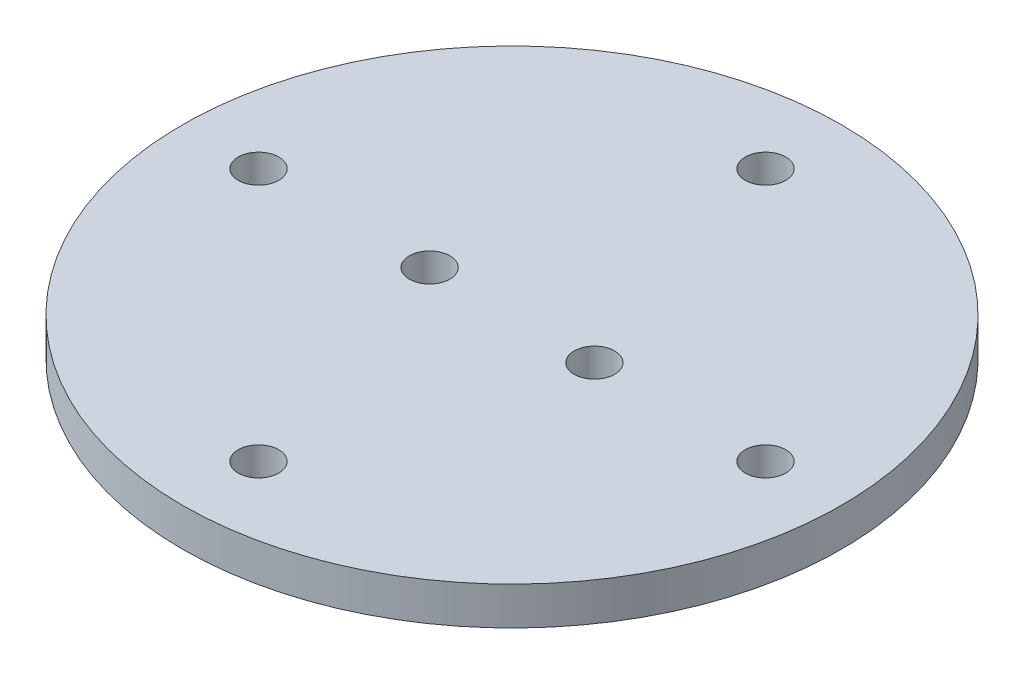
ISO-10303-21;
HEADER;
FILE_DESCRIPTION(('STEP AP214'),'2;1');
FILE_NAME('part.step','',(''),(''),'','','');
FILE_SCHEMA(('AUTOMOTIVE_DESIGN { 1 0 10303 214 1 1 1 1 }'));
ENDSEC;
DATA;
#1=APPLICATION_CONTEXT('core data for automotive mechanical design processes');
#2=APPLICATION_PROTOCOL_DEFINITION('international standard','automotive_design',2000,#1);
#3=PRODUCT_CONTEXT('',#1,'mechanical');
#4=PRODUCT('Part','Part','',(#3));
#5=PRODUCT_RELATED_PRODUCT_CATEGORY('part','',(#4));
#6=PRODUCT_DEFINITION_FORMATION('','',#4);
#7=PRODUCT_DEFINITION_CONTEXT('part definition',#1,'design');
#8=PRODUCT_DEFINITION('design','',#6,#7);
#9=PRODUCT_DEFINITION_SHAPE('','',#8);
#10=(LENGTH_UNIT() NAMED_UNIT(*) SI_UNIT(.MILLI.,.METRE.));
#11=(NAMED_UNIT(*) PLANE_ANGLE_UNIT() SI_UNIT($,.RADIAN.));
#12=(NAMED_UNIT(*) SI_UNIT($,.STERADIAN.) SOLID_ANGLE_UNIT());
#13=UNCERTAINTY_MEASURE_WITH_UNIT(LENGTH_MEASURE(1.E-05),#10,'distance_accuracy_value','');
#14=(GEOMETRIC_REPRESENTATION_CONTEXT(3) GLOBAL_UNCERTAINTY_ASSIGNED_CONTEXT((#13)) GLOBAL_UNIT_ASSIGNED_CONTEXT((#10,
#11,#12)) REPRESENTATION_CONTEXT('',''));
#15=CARTESIAN_POINT('',(0.,0.,0.));
#16=DIRECTION('',(0.,0.,1.));
#17=DIRECTION('',(1.,0.,0.));
#18=AXIS2_PLACEMENT_3D('',#15,#16,#17);
#19=CARTESIAN_POINT('',(0.,3.,0.));
#20=DIRECTION('',(0.,1.,0.));
#21=DIRECTION('',(0.,0.,1.));
#22=AXIS2_PLACEMENT_3D('',#19,#20,#21);
#23=PLANE('',#22);
#24=CARTESIAN_POINT('',(20.,3.,0.));
#25=DIRECTION('',(0.,1.,0.));
#26=DIRECTION('',(0.,0.,1.));
#27=AXIS2_PLACEMENT_3D('',#24,#25,#26);
#28=CIRCLE('',#27,1.6);
#29=CARTESIAN_POINT('',(20.,3.,1.6));
#30=VERTEX_POINT('',#29);
#31=EDGE_CURVE('E73',#30,#30,#28,.T.);
#32=ORIENTED_EDGE('',*,*,#31,.F.);
#33=EDGE_LOOP('',(#32));
#34=FACE_BOUND('',#33,.T.);
#35=CARTESIAN_POINT('',(-20.,3.,0.));
#36=DIRECTION('',(0.,1.,0.));
#37=DIRECTION('',(0.,0.,1.));
#38=AXIS2_PLACEMENT_3D('',#35,#36,#37);
#39=CIRCLE('',#38,1.6);
#40=CARTESIAN_POINT('',(-20.,3.,1.6));
#41=VERTEX_POINT('',#40);
#42=EDGE_CURVE('E61',#41,#41,#39,.T.);
#43=ORIENTED_EDGE('',*,*,#42,.F.);
#44=EDGE_LOOP('',(#43));
#45=FACE_BOUND('',#44,.T.);
#46=CARTESIAN_POINT('',(-6.5,3.,0.));
#47=DIRECTION('',(0.,1.,0.));
#48=DIRECTION('',(0.,0.,1.));
#49=AXIS2_PLACEMENT_3D('',#46,#47,#48);
#50=CIRCLE('',#49,1.6);
#51=CARTESIAN_POINT('',(-6.5,3.,1.6));
#52=VERTEX_POINT('',#51);
#53=EDGE_CURVE('E50',#52,#52,#50,.T.);
#54=ORIENTED_EDGE('',*,*,#53,.F.);
#55=EDGE_LOOP('',(#54));
#56=FACE_BOUND('',#55,.T.);
#57=CARTESIAN_POINT('',(0.,3.,0.));
#58=DIRECTION('',(0.,1.,0.));
#59=DIRECTION('',(0.,0.,1.));
#60=AXIS2_PLACEMENT_3D('',#57,#58,#59);
#61=CIRCLE('',#60,26.);
#62=CARTESIAN_POINT('',(0.,3.,26.));
#63=VERTEX_POINT('',#62);
#64=EDGE_CURVE('E10',#63,#63,#61,.T.);
#65=ORIENTED_EDGE('',*,*,#64,.T.);
#66=EDGE_LOOP('',(#65));
#67=FACE_BOUND('',#66,.T.);
#68=CARTESIAN_POINT('',(6.5,3.,0.));
#69=DIRECTION('',(0.,1.,0.));
#70=DIRECTION('',(0.,0.,1.));
#71=AXIS2_PLACEMENT_3D('',#68,#69,#70);
#72=CIRCLE('',#71,1.6);
#73=CARTESIAN_POINT('',(6.5,3.,1.6));
#74=VERTEX_POINT('',#73);
#75=EDGE_CURVE('E55',#74,#74,#72,.T.);
#76=ORIENTED_EDGE('',*,*,#75,.F.);
#77=EDGE_LOOP('',(#76));
#78=FACE_BOUND('',#77,.T.);
#79=CARTESIAN_POINT('',(0.,3.,-20.));
#80=DIRECTION('',(0.,1.,0.));
#81=DIRECTION('',(0.,0.,1.));
#82=AXIS2_PLACEMENT_3D('',#79,#80,#81);
#83=CIRCLE('',#82,1.6);
#84=CARTESIAN_POINT('',(0.,3.,-18.4));
#85=VERTEX_POINT('',#84);
#86=EDGE_CURVE('E67',#85,#85,#83,.T.);
#87=ORIENTED_EDGE('',*,*,#86,.F.);
#88=EDGE_LOOP('',(#87));
#89=FACE_BOUND('',#88,.T.);
#90=CARTESIAN_POINT('',(0.,3.,20.));
#91=DIRECTION('',(0.,1.,0.));
#92=DIRECTION('',(0.,0.,1.));
#93=AXIS2_PLACEMENT_3D('',#90,#91,#92);
#94=CIRCLE('',#93,1.6);
#95=CARTESIAN_POINT('',(0.,3.,21.6));
#96=VERTEX_POINT('',#95);
#97=EDGE_CURVE('E79',#96,#96,#94,.T.);
#98=ORIENTED_EDGE('',*,*,#97,.F.);
#99=EDGE_LOOP('',(#98));
#100=FACE_BOUND('',#99,.T.);
#101=ADVANCED_FACE('F39',(#34,#45,#56,#67,#78,#89,#100),#23,.T.);
#102=CARTESIAN_POINT('',(0.,0.,0.));
#103=DIRECTION('',(0.,1.,0.));
#104=DIRECTION('',(0.,0.,1.));
#105=AXIS2_PLACEMENT_3D('',#102,#103,#104);
#106=PLANE('',#105);
#107=CARTESIAN_POINT('',(0.,0.,0.));
#108=DIRECTION('',(0.,1.,0.));
#109=DIRECTION('',(0.,0.,1.));
#110=AXIS2_PLACEMENT_3D('',#107,#108,#109);
#111=CIRCLE('',#110,26.);
#112=CARTESIAN_POINT('',(0.,0.,26.));
#113=VERTEX_POINT('',#112);
#114=EDGE_CURVE('E43',#113,#113,#111,.T.);
#115=ORIENTED_EDGE('',*,*,#114,.F.);
#116=EDGE_LOOP('',(#115));
#117=FACE_BOUND('',#116,.T.);
#118=CARTESIAN_POINT('',(-6.5,0.,0.));
#119=DIRECTION('',(0.,1.,0.));
#120=DIRECTION('',(0.,0.,1.));
#121=AXIS2_PLACEMENT_3D('',#118,#119,#120);
#122=CIRCLE('',#121,1.6);
#123=CARTESIAN_POINT('',(-6.5,0.,1.6));
#124=VERTEX_POINT('',#123);
#125=EDGE_CURVE('E52',#124,#124,#122,.T.);
#126=ORIENTED_EDGE('',*,*,#125,.T.);
#127=EDGE_LOOP('',(#126));
#128=FACE_BOUND('',#127,.T.);
#129=CARTESIAN_POINT('',(6.5,0.,0.));
#130=DIRECTION('',(0.,1.,0.));
#131=DIRECTION('',(0.,0.,1.));
#132=AXIS2_PLACEMENT_3D('',#129,#130,#131);
#133=CIRCLE('',#132,1.6);
#134=CARTESIAN_POINT('',(6.5,0.,1.6));
#135=VERTEX_POINT('',#134);
#136=EDGE_CURVE('E58',#135,#135,#133,.T.);
#137=ORIENTED_EDGE('',*,*,#136,.T.);
#138=EDGE_LOOP('',(#137));
#139=FACE_BOUND('',#138,.T.);
#140=CARTESIAN_POINT('',(-20.,0.,0.));
#141=DIRECTION('',(0.,1.,0.));
#142=DIRECTION('',(0.,0.,1.));
#143=AXIS2_PLACEMENT_3D('',#140,#141,#142);
#144=CIRCLE('',#143,1.6);
#145=CARTESIAN_POINT('',(-20.,0.,1.6));
#146=VERTEX_POINT('',#145);
#147=EDGE_CURVE('E64',#146,#146,#144,.T.);
#148=ORIENTED_EDGE('',*,*,#147,.T.);
#149=EDGE_LOOP('',(#148));
#150=FACE_BOUND('',#149,.T.);
#151=CARTESIAN_POINT('',(0.,0.,-20.));
#152=DIRECTION('',(0.,1.,0.));
#153=DIRECTION('',(0.,0.,1.));
#154=AXIS2_PLACEMENT_3D('',#151,#152,#153);
#155=CIRCLE('',#154,1.6);
#156=CARTESIAN_POINT('',(0.,0.,-18.4));
#157=VERTEX_POINT('',#156);
#158=EDGE_CURVE('E70',#157,#157,#155,.T.);
#159=ORIENTED_EDGE('',*,*,#158,.T.);
#160=EDGE_LOOP('',(#159));
#161=FACE_BOUND('',#160,.T.);
#162=CARTESIAN_POINT('',(20.,0.,0.));
#163=DIRECTION('',(0.,1.,0.));
#164=DIRECTION('',(0.,0.,1.));
#165=AXIS2_PLACEMENT_3D('',#162,#163,#164);
#166=CIRCLE('',#165,1.6);
#167=CARTESIAN_POINT('',(20.,0.,1.6));
#168=VERTEX_POINT('',#167);
#169=EDGE_CURVE('E76',#168,#168,#166,.T.);
#170=ORIENTED_EDGE('',*,*,#169,.T.);
#171=EDGE_LOOP('',(#170));
#172=FACE_BOUND('',#171,.T.);
#173=CARTESIAN_POINT('',(0.,0.,20.));
#174=DIRECTION('',(0.,1.,0.));
#175=DIRECTION('',(0.,0.,1.));
#176=AXIS2_PLACEMENT_3D('',#173,#174,#175);
#177=CIRCLE('',#176,1.6);
#178=CARTESIAN_POINT('',(0.,0.,21.6));
#179=VERTEX_POINT('',#178);
#180=EDGE_CURVE('E82',#179,#179,#177,.T.);
#181=ORIENTED_EDGE('',*,*,#180,.T.);
#182=EDGE_LOOP('',(#181));
#183=FACE_BOUND('',#182,.T.);
#184=ADVANCED_FACE('F92',(#117,#128,#139,#150,#161,#172,#183),#106,.F.);
#185=CARTESIAN_POINT('',(0.,3.,0.));
#186=DIRECTION('',(0.,-1.,0.));
#187=DIRECTION('',(0.,0.,-1.));
#188=AXIS2_PLACEMENT_3D('',#185,#186,#187);
#189=CYLINDRICAL_SURFACE('',#188,26.);
#190=ORIENTED_EDGE('',*,*,#64,.F.);
#191=EDGE_LOOP('',(#190));
#192=FACE_BOUND('',#191,.T.);
#193=ORIENTED_EDGE('',*,*,#114,.T.);
#194=EDGE_LOOP('',(#193));
#195=FACE_BOUND('',#194,.T.);
#196=ADVANCED_FACE('F41',(#192,#195),#189,.T.);
#197=CARTESIAN_POINT('',(-6.5,3.,0.));
#198=DIRECTION('',(0.,-1.,0.));
#199=DIRECTION('',(0.,0.,-1.));
#200=AXIS2_PLACEMENT_3D('',#197,#198,#199);
#201=CYLINDRICAL_SURFACE('',#200,1.6);
#202=ORIENTED_EDGE('',*,*,#53,.T.);
#203=EDGE_LOOP('',(#202));
#204=FACE_BOUND('',#203,.T.);
#205=ORIENTED_EDGE('',*,*,#125,.F.);
#206=EDGE_LOOP('',(#205));
#207=FACE_BOUND('',#206,.T.);
#208=ADVANCED_FACE('F102',(#204,#207),#201,.F.);
#209=CARTESIAN_POINT('',(6.5,3.,0.));
#210=DIRECTION('',(0.,-1.,0.));
#211=DIRECTION('',(0.,0.,-1.));
#212=AXIS2_PLACEMENT_3D('',#209,#210,#211);
#213=CYLINDRICAL_SURFACE('',#212,1.6);
#214=ORIENTED_EDGE('',*,*,#75,.T.);
#215=EDGE_LOOP('',(#214));
#216=FACE_BOUND('',#215,.T.);
#217=ORIENTED_EDGE('',*,*,#136,.F.);
#218=EDGE_LOOP('',(#217));
#219=FACE_BOUND('',#218,.T.);
#220=ADVANCED_FACE('F105',(#216,#219),#213,.F.);
#221=CARTESIAN_POINT('',(-20.,3.,0.));
#222=DIRECTION('',(0.,-1.,0.));
#223=DIRECTION('',(0.,0.,-1.));
#224=AXIS2_PLACEMENT_3D('',#221,#222,#223);
#225=CYLINDRICAL_SURFACE('',#224,1.6);
#226=ORIENTED_EDGE('',*,*,#42,.T.);
#227=EDGE_LOOP('',(#226));
#228=FACE_BOUND('',#227,.T.);
#229=ORIENTED_EDGE('',*,*,#147,.F.);
#230=EDGE_LOOP('',(#229));
#231=FACE_BOUND('',#230,.T.);
#232=ADVANCED_FACE('F109',(#228,#231),#225,.F.);
#233=CARTESIAN_POINT('',(0.,3.,-20.));
#234=DIRECTION('',(0.,-1.,0.));
#235=DIRECTION('',(0.,0.,-1.));
#236=AXIS2_PLACEMENT_3D('',#233,#234,#235);
#237=CYLINDRICAL_SURFACE('',#236,1.6);
#238=ORIENTED_EDGE('',*,*,#86,.T.);
#239=EDGE_LOOP('',(#238));
#240=FACE_BOUND('',#239,.T.);
#241=ORIENTED_EDGE('',*,*,#158,.F.);
#242=EDGE_LOOP('',(#241));
#243=FACE_BOUND('',#242,.T.);
#244=ADVANCED_FACE('F113',(#240,#243),#237,.F.);
#245=CARTESIAN_POINT('',(20.,3.,0.));
#246=DIRECTION('',(0.,-1.,0.));
#247=DIRECTION('',(0.,0.,-1.));
#248=AXIS2_PLACEMENT_3D('',#245,#246,#247);
#249=CYLINDRICAL_SURFACE('',#248,1.6);
#250=ORIENTED_EDGE('',*,*,#31,.T.);
#251=EDGE_LOOP('',(#250));
#252=FACE_BOUND('',#251,.T.);
#253=ORIENTED_EDGE('',*,*,#169,.F.);
#254=EDGE_LOOP('',(#253));
#255=FACE_BOUND('',#254,.T.);
#256=ADVANCED_FACE('F117',(#252,#255),#249,.F.);
#257=CARTESIAN_POINT('',(0.,3.,20.));
#258=DIRECTION('',(0.,-1.,0.));
#259=DIRECTION('',(0.,0.,-1.));
#260=AXIS2_PLACEMENT_3D('',#257,#258,#259);
#261=CYLINDRICAL_SURFACE('',#260,1.6);
#262=ORIENTED_EDGE('',*,*,#97,.T.);
#263=EDGE_LOOP('',(#262));
#264=FACE_BOUND('',#263,.T.);
#265=ORIENTED_EDGE('',*,*,#180,.F.);
#266=EDGE_LOOP('',(#265));
#267=FACE_BOUND('',#266,.T.);
#268=ADVANCED_FACE('F88',(#264,#267),#261,.F.);
#269=CLOSED_SHELL('',(#101,#184,#196,#208,#220,#232,#244,#256,#268));
#270=MANIFOLD_SOLID_BREP('B2',#269);
#271=ADVANCED_BREP_SHAPE_REPRESENTATION('',(#18,#270),#14);
#272=SHAPE_DEFINITION_REPRESENTATION(#9,#271);
ENDSEC;
END-ISO-10303-21;
